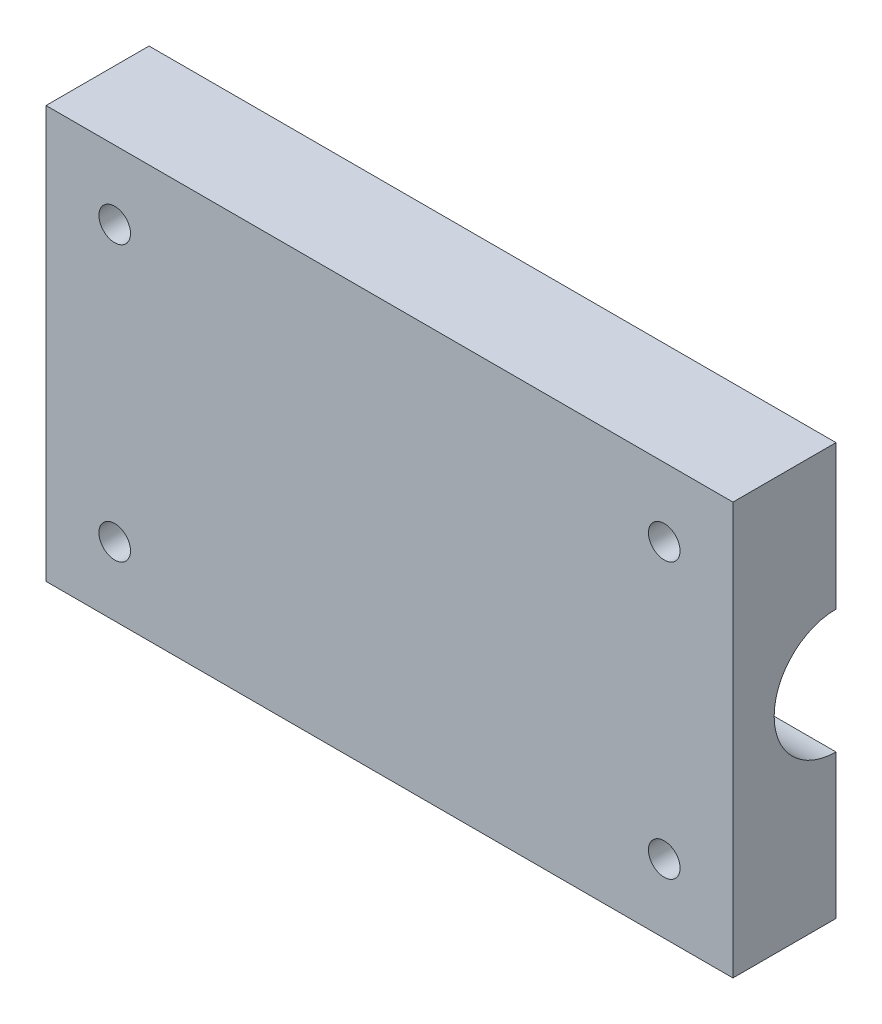
ISO-10303-21;
HEADER;
FILE_DESCRIPTION(('STEP AP214'),'2;1');
FILE_NAME('part.step','',(''),(''),'','','');
FILE_SCHEMA(('AUTOMOTIVE_DESIGN { 1 0 10303 214 1 1 1 1 }'));
ENDSEC;
DATA;
#1=APPLICATION_CONTEXT('core data for automotive mechanical design processes');
#2=APPLICATION_PROTOCOL_DEFINITION('international standard','automotive_design',2000,#1);
#3=PRODUCT_CONTEXT('',#1,'mechanical');
#4=PRODUCT('Part','Part','',(#3));
#5=PRODUCT_RELATED_PRODUCT_CATEGORY('part','',(#4));
#6=PRODUCT_DEFINITION_FORMATION('','',#4);
#7=PRODUCT_DEFINITION_CONTEXT('part definition',#1,'design');
#8=PRODUCT_DEFINITION('design','',#6,#7);
#9=PRODUCT_DEFINITION_SHAPE('','',#8);
#10=(LENGTH_UNIT() NAMED_UNIT(*) SI_UNIT(.MILLI.,.METRE.));
#11=(NAMED_UNIT(*) PLANE_ANGLE_UNIT() SI_UNIT($,.RADIAN.));
#12=(NAMED_UNIT(*) SI_UNIT($,.STERADIAN.) SOLID_ANGLE_UNIT());
#13=UNCERTAINTY_MEASURE_WITH_UNIT(LENGTH_MEASURE(1.E-05),#10,'distance_accuracy_value','');
#14=(GEOMETRIC_REPRESENTATION_CONTEXT(3) GLOBAL_UNCERTAINTY_ASSIGNED_CONTEXT((#13)) GLOBAL_UNIT_ASSIGNED_CONTEXT((#10,
#11,#12)) REPRESENTATION_CONTEXT('',''));
#15=CARTESIAN_POINT('',(0.,0.,0.));
#16=DIRECTION('',(0.,0.,1.));
#17=DIRECTION('',(1.,0.,0.));
#18=AXIS2_PLACEMENT_3D('',#15,#16,#17);
#19=CARTESIAN_POINT('',(0.,0.,0.));
#20=DIRECTION('',(0.,0.,1.));
#21=DIRECTION('',(1.,0.,0.));
#22=AXIS2_PLACEMENT_3D('',#19,#20,#21);
#23=PLANE('',#22);
#24=CARTESIAN_POINT('',(-40.,20.,0.));
#25=DIRECTION('',(0.,0.,1.));
#26=DIRECTION('',(-1.,0.,0.));
#27=AXIS2_PLACEMENT_3D('',#24,#25,#26);
#28=CIRCLE('',#27,2.3);
#29=CARTESIAN_POINT('',(-42.3,20.,0.));
#30=VERTEX_POINT('',#29);
#31=EDGE_CURVE('E161',#30,#30,#28,.T.);
#32=ORIENTED_EDGE('',*,*,#31,.T.);
#33=EDGE_LOOP('',(#32));
#34=FACE_BOUND('',#33,.T.);
#35=CARTESIAN_POINT('',(40.,20.,0.));
#36=DIRECTION('',(0.,0.,1.));
#37=DIRECTION('',(1.,0.,0.));
#38=AXIS2_PLACEMENT_3D('',#35,#36,#37);
#39=CIRCLE('',#38,2.3);
#40=CARTESIAN_POINT('',(42.3,20.,0.));
#41=VERTEX_POINT('',#40);
#42=EDGE_CURVE('E154',#41,#41,#39,.T.);
#43=ORIENTED_EDGE('',*,*,#42,.T.);
#44=EDGE_LOOP('',(#43));
#45=FACE_BOUND('',#44,.T.);
#46=DIRECTION('',(0.,1.,0.));
#47=VECTOR('',#46,1.);
#48=CARTESIAN_POINT('',(50.,30.,0.));
#49=LINE('',#48,#47);
#50=CARTESIAN_POINT('',(50.,9.,0.));
#51=VERTEX_POINT('',#50);
#52=CARTESIAN_POINT('',(50.,30.,0.));
#53=VERTEX_POINT('',#52);
#54=EDGE_CURVE('E109',#51,#53,#49,.T.);
#55=ORIENTED_EDGE('',*,*,#54,.F.);
#56=DIRECTION('',(-1.,0.,0.));
#57=VECTOR('',#56,1.);
#58=CARTESIAN_POINT('',(150.,9.,0.));
#59=LINE('',#58,#57);
#60=CARTESIAN_POINT('',(-50.,9.,0.));
#61=VERTEX_POINT('',#60);
#62=EDGE_CURVE('E99',#51,#61,#59,.T.);
#63=ORIENTED_EDGE('',*,*,#62,.T.);
#64=DIRECTION('',(0.,-1.,0.));
#65=VECTOR('',#64,1.);
#66=CARTESIAN_POINT('',(-50.,30.,0.));
#67=LINE('',#66,#65);
#68=CARTESIAN_POINT('',(-50.,30.,0.));
#69=VERTEX_POINT('',#68);
#70=EDGE_CURVE('E108',#69,#61,#67,.T.);
#71=ORIENTED_EDGE('',*,*,#70,.F.);
#72=DIRECTION('',(-1.,0.,0.));
#73=VECTOR('',#72,1.);
#74=CARTESIAN_POINT('',(-50.,30.,0.));
#75=LINE('',#74,#73);
#76=EDGE_CURVE('E124',#53,#69,#75,.T.);
#77=ORIENTED_EDGE('',*,*,#76,.F.);
#78=EDGE_LOOP('',(#55,#63,#71,#77));
#79=FACE_BOUND('',#78,.T.);
#80=ADVANCED_FACE('F39',(#34,#45,#79),#23,.F.);
#81=CARTESIAN_POINT('',(0.,0.,15.));
#82=DIRECTION('',(0.,0.,1.));
#83=DIRECTION('',(1.,0.,0.));
#84=AXIS2_PLACEMENT_3D('',#81,#82,#83);
#85=PLANE('',#84);
#86=CARTESIAN_POINT('',(40.,20.,15.));
#87=DIRECTION('',(0.,0.,1.));
#88=DIRECTION('',(1.,0.,0.));
#89=AXIS2_PLACEMENT_3D('',#86,#87,#88);
#90=CIRCLE('',#89,2.3);
#91=CARTESIAN_POINT('',(42.3,20.,15.));
#92=VERTEX_POINT('',#91);
#93=EDGE_CURVE('E155',#92,#92,#90,.T.);
#94=ORIENTED_EDGE('',*,*,#93,.F.);
#95=EDGE_LOOP('',(#94));
#96=FACE_BOUND('',#95,.T.);
#97=CARTESIAN_POINT('',(-40.,-20.,15.));
#98=DIRECTION('',(0.,0.,1.));
#99=DIRECTION('',(1.,0.,0.));
#100=AXIS2_PLACEMENT_3D('',#97,#98,#99);
#101=CIRCLE('',#100,2.3);
#102=CARTESIAN_POINT('',(-37.7,-20.,15.));
#103=VERTEX_POINT('',#102);
#104=EDGE_CURVE('E134',#103,#103,#101,.T.);
#105=ORIENTED_EDGE('',*,*,#104,.F.);
#106=EDGE_LOOP('',(#105));
#107=FACE_BOUND('',#106,.T.);
#108=DIRECTION('',(0.,1.,0.));
#109=VECTOR('',#108,1.);
#110=CARTESIAN_POINT('',(50.,30.,15.));
#111=LINE('',#110,#109);
#112=CARTESIAN_POINT('',(50.,-30.,15.));
#113=VERTEX_POINT('',#112);
#114=CARTESIAN_POINT('',(50.,30.,15.));
#115=VERTEX_POINT('',#114);
#116=EDGE_CURVE('E118',#113,#115,#111,.T.);
#117=ORIENTED_EDGE('',*,*,#116,.T.);
#118=DIRECTION('',(-1.,0.,0.));
#119=VECTOR('',#118,1.);
#120=CARTESIAN_POINT('',(-50.,30.,15.));
#121=LINE('',#120,#119);
#122=CARTESIAN_POINT('',(-50.,30.,15.));
#123=VERTEX_POINT('',#122);
#124=EDGE_CURVE('E93',#115,#123,#121,.T.);
#125=ORIENTED_EDGE('',*,*,#124,.T.);
#126=DIRECTION('',(0.,-1.,0.));
#127=VECTOR('',#126,1.);
#128=CARTESIAN_POINT('',(-50.,30.,15.));
#129=LINE('',#128,#127);
#130=CARTESIAN_POINT('',(-50.,-30.,15.));
#131=VERTEX_POINT('',#130);
#132=EDGE_CURVE('E138',#123,#131,#129,.T.);
#133=ORIENTED_EDGE('',*,*,#132,.T.);
#134=DIRECTION('',(1.,0.,0.));
#135=VECTOR('',#134,1.);
#136=CARTESIAN_POINT('',(-50.,-30.,15.));
#137=LINE('',#136,#135);
#138=EDGE_CURVE('E65',#131,#113,#137,.T.);
#139=ORIENTED_EDGE('',*,*,#138,.T.);
#140=EDGE_LOOP('',(#117,#125,#133,#139));
#141=FACE_BOUND('',#140,.T.);
#142=CARTESIAN_POINT('',(40.,-20.,15.));
#143=DIRECTION('',(0.,0.,1.));
#144=DIRECTION('',(-1.,0.,0.));
#145=AXIS2_PLACEMENT_3D('',#142,#143,#144);
#146=CIRCLE('',#145,2.3);
#147=CARTESIAN_POINT('',(37.7,-20.,15.));
#148=VERTEX_POINT('',#147);
#149=EDGE_CURVE('E148',#148,#148,#146,.T.);
#150=ORIENTED_EDGE('',*,*,#149,.F.);
#151=EDGE_LOOP('',(#150));
#152=FACE_BOUND('',#151,.T.);
#153=CARTESIAN_POINT('',(-40.,20.,15.));
#154=DIRECTION('',(0.,0.,1.));
#155=DIRECTION('',(-1.,0.,0.));
#156=AXIS2_PLACEMENT_3D('',#153,#154,#155);
#157=CIRCLE('',#156,2.3);
#158=CARTESIAN_POINT('',(-42.3,20.,15.));
#159=VERTEX_POINT('',#158);
#160=EDGE_CURVE('E158',#159,#159,#157,.T.);
#161=ORIENTED_EDGE('',*,*,#160,.F.);
#162=EDGE_LOOP('',(#161));
#163=FACE_BOUND('',#162,.T.);
#164=ADVANCED_FACE('F186',(#96,#107,#141,#152,#163),#85,.T.);
#165=CARTESIAN_POINT('',(-50.,-9.,0.));
#166=VERTEX_POINT('',#165);
#167=CARTESIAN_POINT('',(-50.,-30.,0.));
#168=VERTEX_POINT('',#167);
#169=EDGE_CURVE('E120',#166,#168,#67,.T.);
#170=ORIENTED_EDGE('',*,*,#169,.F.);
#171=DIRECTION('',(-1.,0.,0.));
#172=VECTOR('',#171,1.);
#173=CARTESIAN_POINT('',(150.,-9.,0.));
#174=LINE('',#173,#172);
#175=CARTESIAN_POINT('',(50.,-9.,0.));
#176=VERTEX_POINT('',#175);
#177=EDGE_CURVE('E53',#166,#176,#174,.F.);
#178=ORIENTED_EDGE('',*,*,#177,.T.);
#179=CARTESIAN_POINT('',(50.,-30.,0.));
#180=VERTEX_POINT('',#179);
#181=EDGE_CURVE('E133',#180,#176,#49,.T.);
#182=ORIENTED_EDGE('',*,*,#181,.F.);
#183=DIRECTION('',(1.,0.,0.));
#184=VECTOR('',#183,1.);
#185=CARTESIAN_POINT('',(-50.,-30.,0.));
#186=LINE('',#185,#184);
#187=EDGE_CURVE('E85',#168,#180,#186,.T.);
#188=ORIENTED_EDGE('',*,*,#187,.F.);
#189=EDGE_LOOP('',(#170,#178,#182,#188));
#190=FACE_BOUND('',#189,.T.);
#191=CARTESIAN_POINT('',(-40.,-20.,0.));
#192=DIRECTION('',(0.,0.,1.));
#193=DIRECTION('',(1.,0.,0.));
#194=AXIS2_PLACEMENT_3D('',#191,#192,#193);
#195=CIRCLE('',#194,2.3);
#196=CARTESIAN_POINT('',(-37.7,-20.,0.));
#197=VERTEX_POINT('',#196);
#198=EDGE_CURVE('E141',#197,#197,#195,.T.);
#199=ORIENTED_EDGE('',*,*,#198,.T.);
#200=EDGE_LOOP('',(#199));
#201=FACE_BOUND('',#200,.T.);
#202=CARTESIAN_POINT('',(40.,-20.,0.));
#203=DIRECTION('',(0.,0.,1.));
#204=DIRECTION('',(-1.,0.,0.));
#205=AXIS2_PLACEMENT_3D('',#202,#203,#204);
#206=CIRCLE('',#205,2.3);
#207=CARTESIAN_POINT('',(37.7,-20.,0.));
#208=VERTEX_POINT('',#207);
#209=EDGE_CURVE('E149',#208,#208,#206,.T.);
#210=ORIENTED_EDGE('',*,*,#209,.T.);
#211=EDGE_LOOP('',(#210));
#212=FACE_BOUND('',#211,.T.);
#213=ADVANCED_FACE('F169',(#190,#201,#212),#23,.F.);
#214=CARTESIAN_POINT('',(50.,30.,15.));
#215=DIRECTION('',(-1.,0.,0.));
#216=DIRECTION('',(0.,-1.,0.));
#217=AXIS2_PLACEMENT_3D('',#214,#215,#216);
#218=PLANE('',#217);
#219=ORIENTED_EDGE('',*,*,#181,.T.);
#220=CARTESIAN_POINT('',(50.,0.,0.));
#221=DIRECTION('',(-1.,0.,0.));
#222=DIRECTION('',(0.,-1.,0.));
#223=AXIS2_PLACEMENT_3D('',#220,#221,#222);
#224=CIRCLE('',#223,9.);
#225=EDGE_CURVE('E112',#176,#51,#224,.T.);
#226=ORIENTED_EDGE('',*,*,#225,.T.);
#227=ORIENTED_EDGE('',*,*,#54,.T.);
#228=DIRECTION('',(0.,0.,-1.));
#229=VECTOR('',#228,1.);
#230=CARTESIAN_POINT('',(50.,30.,15.));
#231=LINE('',#230,#229);
#232=EDGE_CURVE('E50',#115,#53,#231,.T.);
#233=ORIENTED_EDGE('',*,*,#232,.F.);
#234=ORIENTED_EDGE('',*,*,#116,.F.);
#235=DIRECTION('',(0.,0.,-1.));
#236=VECTOR('',#235,1.);
#237=CARTESIAN_POINT('',(50.,-30.,15.));
#238=LINE('',#237,#236);
#239=EDGE_CURVE('E122',#113,#180,#238,.T.);
#240=ORIENTED_EDGE('',*,*,#239,.T.);
#241=EDGE_LOOP('',(#219,#226,#227,#233,#234,#240));
#242=FACE_BOUND('',#241,.T.);
#243=ADVANCED_FACE('F41',(#242),#218,.F.);
#244=CARTESIAN_POINT('',(-50.,30.,15.));
#245=DIRECTION('',(0.,-1.,0.));
#246=DIRECTION('',(0.,0.,-1.));
#247=AXIS2_PLACEMENT_3D('',#244,#245,#246);
#248=PLANE('',#247);
#249=ORIENTED_EDGE('',*,*,#76,.T.);
#250=DIRECTION('',(0.,0.,-1.));
#251=VECTOR('',#250,1.);
#252=CARTESIAN_POINT('',(-50.,30.,15.));
#253=LINE('',#252,#251);
#254=EDGE_CURVE('E116',#123,#69,#253,.T.);
#255=ORIENTED_EDGE('',*,*,#254,.F.);
#256=ORIENTED_EDGE('',*,*,#124,.F.);
#257=ORIENTED_EDGE('',*,*,#232,.T.);
#258=EDGE_LOOP('',(#249,#255,#256,#257));
#259=FACE_BOUND('',#258,.T.);
#260=ADVANCED_FACE('F128',(#259),#248,.F.);
#261=CARTESIAN_POINT('',(-50.,30.,15.));
#262=DIRECTION('',(1.,0.,0.));
#263=DIRECTION('',(0.,0.,-1.));
#264=AXIS2_PLACEMENT_3D('',#261,#262,#263);
#265=PLANE('',#264);
#266=ORIENTED_EDGE('',*,*,#70,.T.);
#267=CARTESIAN_POINT('',(-50.,0.,0.));
#268=DIRECTION('',(1.,0.,0.));
#269=DIRECTION('',(0.,0.,-1.));
#270=AXIS2_PLACEMENT_3D('',#267,#268,#269);
#271=CIRCLE('',#270,9.);
#272=EDGE_CURVE('E11',#61,#166,#271,.T.);
#273=ORIENTED_EDGE('',*,*,#272,.T.);
#274=ORIENTED_EDGE('',*,*,#169,.T.);
#275=DIRECTION('',(0.,0.,-1.));
#276=VECTOR('',#275,1.);
#277=CARTESIAN_POINT('',(-50.,-30.,15.));
#278=LINE('',#277,#276);
#279=EDGE_CURVE('E130',#131,#168,#278,.T.);
#280=ORIENTED_EDGE('',*,*,#279,.F.);
#281=ORIENTED_EDGE('',*,*,#132,.F.);
#282=ORIENTED_EDGE('',*,*,#254,.T.);
#283=EDGE_LOOP('',(#266,#273,#274,#280,#281,#282));
#284=FACE_BOUND('',#283,.T.);
#285=ADVANCED_FACE('F111',(#284),#265,.F.);
#286=CARTESIAN_POINT('',(-50.,-30.,15.));
#287=DIRECTION('',(0.,1.,0.));
#288=DIRECTION('',(0.,0.,1.));
#289=AXIS2_PLACEMENT_3D('',#286,#287,#288);
#290=PLANE('',#289);
#291=ORIENTED_EDGE('',*,*,#187,.T.);
#292=ORIENTED_EDGE('',*,*,#239,.F.);
#293=ORIENTED_EDGE('',*,*,#138,.F.);
#294=ORIENTED_EDGE('',*,*,#279,.T.);
#295=EDGE_LOOP('',(#291,#292,#293,#294));
#296=FACE_BOUND('',#295,.T.);
#297=ADVANCED_FACE('F171',(#296),#290,.F.);
#298=CARTESIAN_POINT('',(-40.,-20.,15.));
#299=DIRECTION('',(0.,0.,-1.));
#300=DIRECTION('',(-1.,0.,0.));
#301=AXIS2_PLACEMENT_3D('',#298,#299,#300);
#302=CYLINDRICAL_SURFACE('',#301,2.3);
#303=ORIENTED_EDGE('',*,*,#104,.T.);
#304=EDGE_LOOP('',(#303));
#305=FACE_BOUND('',#304,.T.);
#306=ORIENTED_EDGE('',*,*,#198,.F.);
#307=EDGE_LOOP('',(#306));
#308=FACE_BOUND('',#307,.T.);
#309=ADVANCED_FACE('F172',(#305,#308),#302,.F.);
#310=CARTESIAN_POINT('',(40.,-20.,15.));
#311=DIRECTION('',(0.,0.,-1.));
#312=DIRECTION('',(-1.,0.,0.));
#313=AXIS2_PLACEMENT_3D('',#310,#311,#312);
#314=CYLINDRICAL_SURFACE('',#313,2.3);
#315=ORIENTED_EDGE('',*,*,#149,.T.);
#316=EDGE_LOOP('',(#315));
#317=FACE_BOUND('',#316,.T.);
#318=ORIENTED_EDGE('',*,*,#209,.F.);
#319=EDGE_LOOP('',(#318));
#320=FACE_BOUND('',#319,.T.);
#321=ADVANCED_FACE('F178',(#317,#320),#314,.F.);
#322=CARTESIAN_POINT('',(40.,20.,15.));
#323=DIRECTION('',(0.,0.,-1.));
#324=DIRECTION('',(-1.,0.,0.));
#325=AXIS2_PLACEMENT_3D('',#322,#323,#324);
#326=CYLINDRICAL_SURFACE('',#325,2.3);
#327=ORIENTED_EDGE('',*,*,#93,.T.);
#328=EDGE_LOOP('',(#327));
#329=FACE_BOUND('',#328,.T.);
#330=ORIENTED_EDGE('',*,*,#42,.F.);
#331=EDGE_LOOP('',(#330));
#332=FACE_BOUND('',#331,.T.);
#333=ADVANCED_FACE('F238',(#329,#332),#326,.F.);
#334=CARTESIAN_POINT('',(-40.,20.,15.));
#335=DIRECTION('',(0.,0.,-1.));
#336=DIRECTION('',(-1.,0.,0.));
#337=AXIS2_PLACEMENT_3D('',#334,#335,#336);
#338=CYLINDRICAL_SURFACE('',#337,2.3);
#339=ORIENTED_EDGE('',*,*,#160,.T.);
#340=EDGE_LOOP('',(#339));
#341=FACE_BOUND('',#340,.T.);
#342=ORIENTED_EDGE('',*,*,#31,.F.);
#343=EDGE_LOOP('',(#342));
#344=FACE_BOUND('',#343,.T.);
#345=ADVANCED_FACE('F248',(#341,#344),#338,.F.);
#346=CARTESIAN_POINT('',(150.,0.,0.));
#347=DIRECTION('',(-1.,0.,0.));
#348=DIRECTION('',(0.,0.,1.));
#349=AXIS2_PLACEMENT_3D('',#346,#347,#348);
#350=CYLINDRICAL_SURFACE('',#349,9.);
#351=ORIENTED_EDGE('',*,*,#177,.F.);
#352=ORIENTED_EDGE('',*,*,#272,.F.);
#353=ORIENTED_EDGE('',*,*,#62,.F.);
#354=ORIENTED_EDGE('',*,*,#225,.F.);
#355=EDGE_LOOP('',(#351,#352,#353,#354));
#356=FACE_BOUND('',#355,.T.);
#357=ADVANCED_FACE('F97',(#356),#350,.F.);
#358=CLOSED_SHELL('',(#80,#164,#213,#243,#260,#285,#297,#309,#321,#333,#345,#357));
#359=MANIFOLD_SOLID_BREP('B2',#358);
#360=ADVANCED_BREP_SHAPE_REPRESENTATION('',(#18,#359),#14);
#361=SHAPE_DEFINITION_REPRESENTATION(#9,#360);
ENDSEC;
END-ISO-10303-21;
